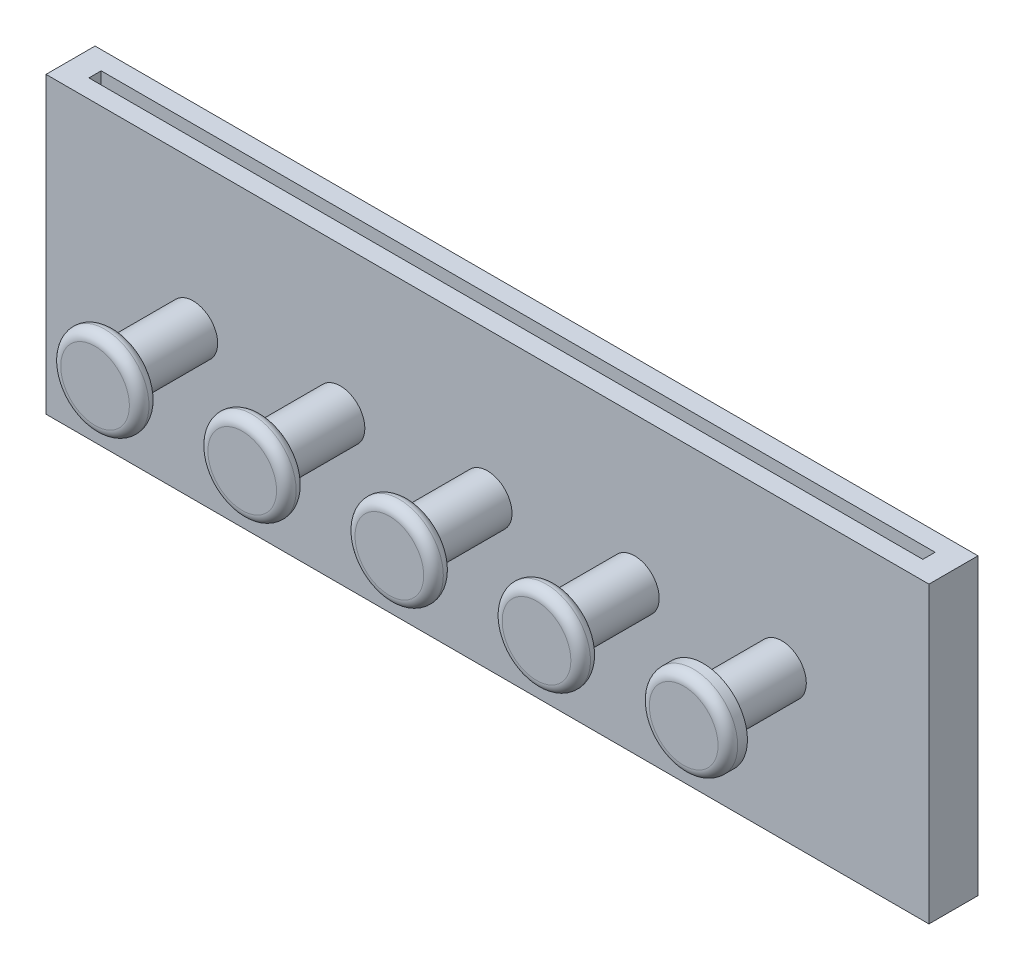
ISO-10303-21;
HEADER;
FILE_DESCRIPTION(('STEP AP214'),'2;1');
FILE_NAME('part.step','',(''),(''),'','','');
FILE_SCHEMA(('AUTOMOTIVE_DESIGN { 1 0 10303 214 1 1 1 1 }'));
ENDSEC;
DATA;
#1=APPLICATION_CONTEXT('core data for automotive mechanical design processes');
#2=APPLICATION_PROTOCOL_DEFINITION('international standard','automotive_design',2000,#1);
#3=PRODUCT_CONTEXT('',#1,'mechanical');
#4=PRODUCT('Part','Part','',(#3));
#5=PRODUCT_RELATED_PRODUCT_CATEGORY('part','',(#4));
#6=PRODUCT_DEFINITION_FORMATION('','',#4);
#7=PRODUCT_DEFINITION_CONTEXT('part definition',#1,'design');
#8=PRODUCT_DEFINITION('design','',#6,#7);
#9=PRODUCT_DEFINITION_SHAPE('','',#8);
#10=(LENGTH_UNIT() NAMED_UNIT(*) SI_UNIT(.MILLI.,.METRE.));
#11=(NAMED_UNIT(*) PLANE_ANGLE_UNIT() SI_UNIT($,.RADIAN.));
#12=(NAMED_UNIT(*) SI_UNIT($,.STERADIAN.) SOLID_ANGLE_UNIT());
#13=UNCERTAINTY_MEASURE_WITH_UNIT(LENGTH_MEASURE(1.E-05),#10,'distance_accuracy_value','');
#14=(GEOMETRIC_REPRESENTATION_CONTEXT(3) GLOBAL_UNCERTAINTY_ASSIGNED_CONTEXT((#13)) GLOBAL_UNIT_ASSIGNED_CONTEXT((#10,
#11,#12)) REPRESENTATION_CONTEXT('',''));
#15=CARTESIAN_POINT('',(0.,0.,0.));
#16=DIRECTION('',(0.,0.,1.));
#17=DIRECTION('',(1.,0.,0.));
#18=AXIS2_PLACEMENT_3D('',#15,#16,#17);
#19=CARTESIAN_POINT('',(96.6369985141159,36.4434315148656,38.1));
#20=DIRECTION('',(0.,0.,-1.));
#21=DIRECTION('',(-1.,0.,0.));
#22=AXIS2_PLACEMENT_3D('',#19,#20,#21);
#23=CYLINDRICAL_SURFACE('',#22,6.35);
#24=CARTESIAN_POINT('',(96.6369985141159,36.4434315148656,12.7));
#25=DIRECTION('',(0.,0.,1.));
#26=DIRECTION('',(1.,0.,0.));
#27=AXIS2_PLACEMENT_3D('',#24,#25,#26);
#28=CIRCLE('',#27,6.35);
#29=CARTESIAN_POINT('',(102.986998514116,36.4434315148656,12.7));
#30=VERTEX_POINT('',#29);
#31=EDGE_CURVE('E188',#30,#30,#28,.T.);
#32=ORIENTED_EDGE('',*,*,#31,.T.);
#33=EDGE_LOOP('',(#32));
#34=FACE_BOUND('',#33,.T.);
#35=CARTESIAN_POINT('',(96.6369985141159,36.4434315148656,33.02));
#36=DIRECTION('',(0.,0.,1.));
#37=DIRECTION('',(1.,0.,0.));
#38=AXIS2_PLACEMENT_3D('',#35,#36,#37);
#39=CIRCLE('',#38,6.35);
#40=CARTESIAN_POINT('',(102.986998514116,36.4434315148656,33.02));
#41=VERTEX_POINT('',#40);
#42=EDGE_CURVE('E243',#41,#41,#39,.T.);
#43=ORIENTED_EDGE('',*,*,#42,.F.);
#44=EDGE_LOOP('',(#43));
#45=FACE_BOUND('',#44,.T.);
#46=ADVANCED_FACE('F39',(#34,#45),#23,.T.);
#47=CARTESIAN_POINT('',(58.5369985141159,36.4434315148656,38.1));
#48=DIRECTION('',(0.,0.,-1.));
#49=DIRECTION('',(-1.,0.,0.));
#50=AXIS2_PLACEMENT_3D('',#47,#48,#49);
#51=CYLINDRICAL_SURFACE('',#50,6.35);
#52=CARTESIAN_POINT('',(58.5369985141159,36.4434315148656,12.7));
#53=DIRECTION('',(0.,0.,1.));
#54=DIRECTION('',(1.,0.,0.));
#55=AXIS2_PLACEMENT_3D('',#52,#53,#54);
#56=CIRCLE('',#55,6.35);
#57=CARTESIAN_POINT('',(64.8869985141159,36.4434315148656,12.7));
#58=VERTEX_POINT('',#57);
#59=EDGE_CURVE('E184',#58,#58,#56,.T.);
#60=ORIENTED_EDGE('',*,*,#59,.T.);
#61=EDGE_LOOP('',(#60));
#62=FACE_BOUND('',#61,.T.);
#63=CARTESIAN_POINT('',(58.5369985141159,36.4434315148656,33.02));
#64=DIRECTION('',(0.,0.,1.));
#65=DIRECTION('',(1.,0.,0.));
#66=AXIS2_PLACEMENT_3D('',#63,#64,#65);
#67=CIRCLE('',#66,6.35);
#68=CARTESIAN_POINT('',(64.8869985141159,36.4434315148656,33.02));
#69=VERTEX_POINT('',#68);
#70=EDGE_CURVE('E239',#69,#69,#67,.T.);
#71=ORIENTED_EDGE('',*,*,#70,.F.);
#72=EDGE_LOOP('',(#71));
#73=FACE_BOUND('',#72,.T.);
#74=ADVANCED_FACE('F312',(#62,#73),#51,.T.);
#75=CARTESIAN_POINT('',(20.4369985141159,36.4434315148656,38.1));
#76=DIRECTION('',(0.,0.,-1.));
#77=DIRECTION('',(-1.,0.,0.));
#78=AXIS2_PLACEMENT_3D('',#75,#76,#77);
#79=CYLINDRICAL_SURFACE('',#78,6.35);
#80=CARTESIAN_POINT('',(20.4369985141159,36.4434315148656,12.7));
#81=DIRECTION('',(0.,0.,1.));
#82=DIRECTION('',(1.,0.,0.));
#83=AXIS2_PLACEMENT_3D('',#80,#81,#82);
#84=CIRCLE('',#83,6.35);
#85=CARTESIAN_POINT('',(26.7869985141159,36.4434315148656,12.7));
#86=VERTEX_POINT('',#85);
#87=EDGE_CURVE('E180',#86,#86,#84,.T.);
#88=ORIENTED_EDGE('',*,*,#87,.T.);
#89=EDGE_LOOP('',(#88));
#90=FACE_BOUND('',#89,.T.);
#91=CARTESIAN_POINT('',(20.4369985141159,36.4434315148656,33.02));
#92=DIRECTION('',(0.,0.,1.));
#93=DIRECTION('',(1.,0.,0.));
#94=AXIS2_PLACEMENT_3D('',#91,#92,#93);
#95=CIRCLE('',#94,6.35);
#96=CARTESIAN_POINT('',(26.7869985141159,36.4434315148656,33.02));
#97=VERTEX_POINT('',#96);
#98=EDGE_CURVE('E235',#97,#97,#95,.T.);
#99=ORIENTED_EDGE('',*,*,#98,.F.);
#100=EDGE_LOOP('',(#99));
#101=FACE_BOUND('',#100,.T.);
#102=ADVANCED_FACE('F318',(#90,#101),#79,.T.);
#103=CARTESIAN_POINT('',(-17.6630014858841,36.4434315148656,38.1));
#104=DIRECTION('',(0.,0.,-1.));
#105=DIRECTION('',(-1.,0.,0.));
#106=AXIS2_PLACEMENT_3D('',#103,#104,#105);
#107=CYLINDRICAL_SURFACE('',#106,6.35);
#108=CARTESIAN_POINT('',(-17.6630014858841,36.4434315148656,12.7));
#109=DIRECTION('',(0.,0.,1.));
#110=DIRECTION('',(1.,0.,0.));
#111=AXIS2_PLACEMENT_3D('',#108,#109,#110);
#112=CIRCLE('',#111,6.35);
#113=CARTESIAN_POINT('',(-11.3130014858841,36.4434315148656,12.7));
#114=VERTEX_POINT('',#113);
#115=EDGE_CURVE('E176',#114,#114,#112,.T.);
#116=ORIENTED_EDGE('',*,*,#115,.T.);
#117=EDGE_LOOP('',(#116));
#118=FACE_BOUND('',#117,.T.);
#119=CARTESIAN_POINT('',(-17.6630014858841,36.4434315148656,33.02));
#120=DIRECTION('',(0.,0.,1.));
#121=DIRECTION('',(1.,0.,0.));
#122=AXIS2_PLACEMENT_3D('',#119,#120,#121);
#123=CIRCLE('',#122,6.35);
#124=CARTESIAN_POINT('',(-11.3130014858841,36.4434315148656,33.02));
#125=VERTEX_POINT('',#124);
#126=EDGE_CURVE('E231',#125,#125,#123,.T.);
#127=ORIENTED_EDGE('',*,*,#126,.F.);
#128=EDGE_LOOP('',(#127));
#129=FACE_BOUND('',#128,.T.);
#130=ADVANCED_FACE('F395',(#118,#129),#107,.T.);
#131=CARTESIAN_POINT('',(-55.7630014858841,36.4434315148656,38.1));
#132=DIRECTION('',(0.,0.,-1.));
#133=DIRECTION('',(-1.,0.,0.));
#134=AXIS2_PLACEMENT_3D('',#131,#132,#133);
#135=CYLINDRICAL_SURFACE('',#134,6.35);
#136=CARTESIAN_POINT('',(-55.7630014858841,36.4434315148656,12.7));
#137=DIRECTION('',(0.,0.,1.));
#138=DIRECTION('',(1.,0.,0.));
#139=AXIS2_PLACEMENT_3D('',#136,#137,#138);
#140=CIRCLE('',#139,6.35);
#141=CARTESIAN_POINT('',(-49.4130014858841,36.4434315148656,12.7));
#142=VERTEX_POINT('',#141);
#143=EDGE_CURVE('E171',#142,#142,#140,.T.);
#144=ORIENTED_EDGE('',*,*,#143,.T.);
#145=EDGE_LOOP('',(#144));
#146=FACE_BOUND('',#145,.T.);
#147=CARTESIAN_POINT('',(-55.7630014858841,36.4434315148656,33.02));
#148=DIRECTION('',(0.,0.,1.));
#149=DIRECTION('',(1.,0.,0.));
#150=AXIS2_PLACEMENT_3D('',#147,#148,#149);
#151=CIRCLE('',#150,6.35);
#152=CARTESIAN_POINT('',(-49.4130014858841,36.4434315148656,33.02));
#153=VERTEX_POINT('',#152);
#154=EDGE_CURVE('E227',#153,#153,#151,.T.);
#155=ORIENTED_EDGE('',*,*,#154,.F.);
#156=EDGE_LOOP('',(#155));
#157=FACE_BOUND('',#156,.T.);
#158=ADVANCED_FACE('F349',(#146,#157),#135,.T.);
#159=CARTESIAN_POINT('',(-93.8630014858841,74.5434315148656,12.7));
#160=DIRECTION('',(1.,0.,0.));
#161=DIRECTION('',(0.,1.,0.));
#162=AXIS2_PLACEMENT_3D('',#159,#160,#161);
#163=PLANE('',#162);
#164=DIRECTION('',(0.,-1.,0.));
#165=VECTOR('',#164,1.);
#166=CARTESIAN_POINT('',(-93.8630014858841,74.5434315148656,0.));
#167=LINE('',#166,#165);
#168=CARTESIAN_POINT('',(-93.8630014858841,74.5434315148656,0.));
#169=VERTEX_POINT('',#168);
#170=CARTESIAN_POINT('',(-93.863001485884,-1.65656848513442,0.));
#171=VERTEX_POINT('',#170);
#172=EDGE_CURVE('E192',#169,#171,#167,.T.);
#173=ORIENTED_EDGE('',*,*,#172,.T.);
#174=DIRECTION('',(0.,0.,-1.));
#175=VECTOR('',#174,1.);
#176=CARTESIAN_POINT('',(-93.863001485884,-1.65656848513442,12.7));
#177=LINE('',#176,#175);
#178=CARTESIAN_POINT('',(-93.863001485884,-1.65656848513442,12.7));
#179=VERTEX_POINT('',#178);
#180=EDGE_CURVE('E224',#179,#171,#177,.T.);
#181=ORIENTED_EDGE('',*,*,#180,.F.);
#182=DIRECTION('',(0.,-1.,0.));
#183=VECTOR('',#182,1.);
#184=CARTESIAN_POINT('',(-93.8630014858841,74.5434315148656,12.7));
#185=LINE('',#184,#183);
#186=CARTESIAN_POINT('',(-93.8630014858841,74.5434315148656,12.7));
#187=VERTEX_POINT('',#186);
#188=EDGE_CURVE('E193',#187,#179,#185,.T.);
#189=ORIENTED_EDGE('',*,*,#188,.F.);
#190=DIRECTION('',(0.,0.,-1.));
#191=VECTOR('',#190,1.);
#192=CARTESIAN_POINT('',(-93.8630014858841,74.5434315148656,12.7));
#193=LINE('',#192,#191);
#194=EDGE_CURVE('E203',#187,#169,#193,.T.);
#195=ORIENTED_EDGE('',*,*,#194,.T.);
#196=EDGE_LOOP('',(#173,#181,#189,#195));
#197=FACE_BOUND('',#196,.T.);
#198=ADVANCED_FACE('F346',(#197),#163,.F.);
#199=CARTESIAN_POINT('',(-93.863001485884,-1.65656848513442,12.7));
#200=DIRECTION('',(0.,1.,0.));
#201=DIRECTION('',(0.,0.,1.));
#202=AXIS2_PLACEMENT_3D('',#199,#200,#201);
#203=PLANE('',#202);
#204=DIRECTION('',(1.,0.,0.));
#205=VECTOR('',#204,1.);
#206=CARTESIAN_POINT('',(-93.863001485884,-1.65656848513442,0.));
#207=LINE('',#206,#205);
#208=CARTESIAN_POINT('',(134.736998514116,-1.65656848513442,0.));
#209=VERTEX_POINT('',#208);
#210=EDGE_CURVE('E207',#171,#209,#207,.T.);
#211=ORIENTED_EDGE('',*,*,#210,.T.);
#212=DIRECTION('',(0.,0.,-1.));
#213=VECTOR('',#212,1.);
#214=CARTESIAN_POINT('',(134.736998514116,-1.65656848513442,12.7));
#215=LINE('',#214,#213);
#216=CARTESIAN_POINT('',(134.736998514116,-1.65656848513442,12.7));
#217=VERTEX_POINT('',#216);
#218=EDGE_CURVE('E220',#217,#209,#215,.T.);
#219=ORIENTED_EDGE('',*,*,#218,.F.);
#220=DIRECTION('',(1.,0.,0.));
#221=VECTOR('',#220,1.);
#222=CARTESIAN_POINT('',(-93.863001485884,-1.65656848513442,12.7));
#223=LINE('',#222,#221);
#224=EDGE_CURVE('E95',#179,#217,#223,.T.);
#225=ORIENTED_EDGE('',*,*,#224,.F.);
#226=ORIENTED_EDGE('',*,*,#180,.T.);
#227=EDGE_LOOP('',(#211,#219,#225,#226));
#228=FACE_BOUND('',#227,.T.);
#229=ADVANCED_FACE('F342',(#228),#203,.F.);
#230=CARTESIAN_POINT('',(134.736998514116,74.5434315148656,12.7));
#231=DIRECTION('',(-1.,0.,0.));
#232=DIRECTION('',(0.,-1.,0.));
#233=AXIS2_PLACEMENT_3D('',#230,#231,#232);
#234=PLANE('',#233);
#235=DIRECTION('',(0.,1.,0.));
#236=VECTOR('',#235,1.);
#237=CARTESIAN_POINT('',(134.736998514116,74.5434315148656,0.));
#238=LINE('',#237,#236);
#239=CARTESIAN_POINT('',(134.736998514116,74.5434315148656,0.));
#240=VERTEX_POINT('',#239);
#241=EDGE_CURVE('E210',#209,#240,#238,.T.);
#242=ORIENTED_EDGE('',*,*,#241,.T.);
#243=DIRECTION('',(0.,0.,-1.));
#244=VECTOR('',#243,1.);
#245=CARTESIAN_POINT('',(134.736998514116,74.5434315148656,12.7));
#246=LINE('',#245,#244);
#247=CARTESIAN_POINT('',(134.736998514116,74.5434315148656,12.7));
#248=VERTEX_POINT('',#247);
#249=EDGE_CURVE('E217',#248,#240,#246,.T.);
#250=ORIENTED_EDGE('',*,*,#249,.F.);
#251=DIRECTION('',(0.,1.,0.));
#252=VECTOR('',#251,1.);
#253=CARTESIAN_POINT('',(134.736998514116,74.5434315148656,12.7));
#254=LINE('',#253,#252);
#255=EDGE_CURVE('E198',#217,#248,#254,.T.);
#256=ORIENTED_EDGE('',*,*,#255,.F.);
#257=ORIENTED_EDGE('',*,*,#218,.T.);
#258=EDGE_LOOP('',(#242,#250,#256,#257));
#259=FACE_BOUND('',#258,.T.);
#260=ADVANCED_FACE('F338',(#259),#234,.F.);
#261=CARTESIAN_POINT('',(-93.8630014858841,74.5434315148656,12.7));
#262=DIRECTION('',(0.,-1.,0.));
#263=DIRECTION('',(0.,0.,-1.));
#264=AXIS2_PLACEMENT_3D('',#261,#262,#263);
#265=PLANE('',#264);
#266=DIRECTION('',(1.,0.,0.));
#267=VECTOR('',#266,1.);
#268=CARTESIAN_POINT('',(-87.5130014858841,74.5434315148656,7.9375));
#269=LINE('',#268,#267);
#270=CARTESIAN_POINT('',(-87.5130014858841,74.5434315148656,7.9375));
#271=VERTEX_POINT('',#270);
#272=CARTESIAN_POINT('',(128.386998514116,74.5434315148656,7.9375));
#273=VERTEX_POINT('',#272);
#274=EDGE_CURVE('E153',#271,#273,#269,.T.);
#275=ORIENTED_EDGE('',*,*,#274,.F.);
#276=DIRECTION('',(0.,0.,1.));
#277=VECTOR('',#276,1.);
#278=CARTESIAN_POINT('',(-87.5130014858841,74.5434315148656,4.7625));
#279=LINE('',#278,#277);
#280=CARTESIAN_POINT('',(-87.5130014858841,74.5434315148656,4.7625));
#281=VERTEX_POINT('',#280);
#282=EDGE_CURVE('E57',#281,#271,#279,.T.);
#283=ORIENTED_EDGE('',*,*,#282,.F.);
#284=DIRECTION('',(-1.,0.,0.));
#285=VECTOR('',#284,1.);
#286=CARTESIAN_POINT('',(-87.5130014858841,74.5434315148656,4.7625));
#287=LINE('',#286,#285);
#288=CARTESIAN_POINT('',(128.386998514116,74.5434315148656,4.7625));
#289=VERTEX_POINT('',#288);
#290=EDGE_CURVE('E140',#289,#281,#287,.T.);
#291=ORIENTED_EDGE('',*,*,#290,.F.);
#292=DIRECTION('',(0.,0.,-1.));
#293=VECTOR('',#292,1.);
#294=CARTESIAN_POINT('',(128.386998514116,74.5434315148656,4.7625));
#295=LINE('',#294,#293);
#296=EDGE_CURVE('E144',#273,#289,#295,.T.);
#297=ORIENTED_EDGE('',*,*,#296,.F.);
#298=EDGE_LOOP('',(#275,#283,#291,#297));
#299=FACE_BOUND('',#298,.T.);
#300=DIRECTION('',(-1.,0.,0.));
#301=VECTOR('',#300,1.);
#302=CARTESIAN_POINT('',(-93.8630014858841,74.5434315148656,0.));
#303=LINE('',#302,#301);
#304=EDGE_CURVE('E87',#240,#169,#303,.T.);
#305=ORIENTED_EDGE('',*,*,#304,.T.);
#306=ORIENTED_EDGE('',*,*,#194,.F.);
#307=DIRECTION('',(-1.,0.,0.));
#308=VECTOR('',#307,1.);
#309=CARTESIAN_POINT('',(-93.8630014858841,74.5434315148656,12.7));
#310=LINE('',#309,#308);
#311=EDGE_CURVE('E66',#248,#187,#310,.T.);
#312=ORIENTED_EDGE('',*,*,#311,.F.);
#313=ORIENTED_EDGE('',*,*,#249,.T.);
#314=EDGE_LOOP('',(#305,#306,#312,#313));
#315=FACE_BOUND('',#314,.T.);
#316=ADVANCED_FACE('F330',(#299,#315),#265,.F.);
#317=CARTESIAN_POINT('',(0.,0.,12.7));
#318=DIRECTION('',(0.,0.,1.));
#319=DIRECTION('',(1.,0.,0.));
#320=AXIS2_PLACEMENT_3D('',#317,#318,#319);
#321=PLANE('',#320);
#322=ORIENTED_EDGE('',*,*,#143,.F.);
#323=EDGE_LOOP('',(#322));
#324=FACE_BOUND('',#323,.T.);
#325=ORIENTED_EDGE('',*,*,#115,.F.);
#326=EDGE_LOOP('',(#325));
#327=FACE_BOUND('',#326,.T.);
#328=ORIENTED_EDGE('',*,*,#87,.F.);
#329=EDGE_LOOP('',(#328));
#330=FACE_BOUND('',#329,.T.);
#331=ORIENTED_EDGE('',*,*,#59,.F.);
#332=EDGE_LOOP('',(#331));
#333=FACE_BOUND('',#332,.T.);
#334=ORIENTED_EDGE('',*,*,#31,.F.);
#335=EDGE_LOOP('',(#334));
#336=FACE_BOUND('',#335,.T.);
#337=ORIENTED_EDGE('',*,*,#188,.T.);
#338=ORIENTED_EDGE('',*,*,#224,.T.);
#339=ORIENTED_EDGE('',*,*,#255,.T.);
#340=ORIENTED_EDGE('',*,*,#311,.T.);
#341=EDGE_LOOP('',(#337,#338,#339,#340));
#342=FACE_BOUND('',#341,.T.);
#343=ADVANCED_FACE('F326',(#324,#327,#330,#333,#336,#342),#321,.T.);
#344=CARTESIAN_POINT('',(0.,0.,0.));
#345=DIRECTION('',(0.,0.,1.));
#346=DIRECTION('',(1.,0.,0.));
#347=AXIS2_PLACEMENT_3D('',#344,#345,#346);
#348=PLANE('',#347);
#349=ORIENTED_EDGE('',*,*,#172,.F.);
#350=ORIENTED_EDGE('',*,*,#304,.F.);
#351=ORIENTED_EDGE('',*,*,#241,.F.);
#352=ORIENTED_EDGE('',*,*,#210,.F.);
#353=EDGE_LOOP('',(#349,#350,#351,#352));
#354=FACE_BOUND('',#353,.T.);
#355=ADVANCED_FACE('F329',(#354),#348,.F.);
#356=CARTESIAN_POINT('',(-55.7630014858841,36.4434315148656,33.02));
#357=DIRECTION('',(0.,0.,1.));
#358=DIRECTION('',(1.,0.,0.));
#359=AXIS2_PLACEMENT_3D('',#356,#357,#358);
#360=PLANE('',#359);
#361=CARTESIAN_POINT('',(-55.7630014858841,36.4434315148656,33.02));
#362=DIRECTION('',(0.,0.,1.));
#363=DIRECTION('',(1.,0.,0.));
#364=AXIS2_PLACEMENT_3D('',#361,#362,#363);
#365=CIRCLE('',#364,8.89);
#366=CARTESIAN_POINT('',(-46.8730014858841,36.4434315148656,33.02));
#367=VERTEX_POINT('',#366);
#368=EDGE_CURVE('E49',#367,#367,#365,.F.);
#369=ORIENTED_EDGE('',*,*,#368,.T.);
#370=EDGE_LOOP('',(#369));
#371=FACE_BOUND('',#370,.T.);
#372=ORIENTED_EDGE('',*,*,#154,.T.);
#373=EDGE_LOOP('',(#372));
#374=FACE_BOUND('',#373,.T.);
#375=ADVANCED_FACE('F334',(#371,#374),#360,.F.);
#376=CARTESIAN_POINT('',(-55.7630014858841,36.4434315148656,38.1));
#377=DIRECTION('',(0.,0.,1.));
#378=DIRECTION('',(1.,0.,0.));
#379=AXIS2_PLACEMENT_3D('',#376,#377,#378);
#380=PLANE('',#379);
#381=CARTESIAN_POINT('',(-55.7630014858841,36.4434315148656,38.1));
#382=DIRECTION('',(0.,0.,1.));
#383=DIRECTION('',(1.,0.,0.));
#384=AXIS2_PLACEMENT_3D('',#381,#382,#383);
#385=CIRCLE('',#384,8.89);
#386=CARTESIAN_POINT('',(-46.8730014858841,36.4434315148656,38.1));
#387=VERTEX_POINT('',#386);
#388=EDGE_CURVE('E11',#387,#387,#385,.T.);
#389=ORIENTED_EDGE('',*,*,#388,.T.);
#390=EDGE_LOOP('',(#389));
#391=FACE_BOUND('',#390,.T.);
#392=ADVANCED_FACE('F390',(#391),#380,.T.);
#393=CARTESIAN_POINT('',(-17.6630014858841,36.4434315148656,33.02));
#394=DIRECTION('',(0.,0.,1.));
#395=DIRECTION('',(1.,0.,0.));
#396=AXIS2_PLACEMENT_3D('',#393,#394,#395);
#397=PLANE('',#396);
#398=CARTESIAN_POINT('',(-17.6630014858841,36.4434315148656,33.02));
#399=DIRECTION('',(0.,0.,1.));
#400=DIRECTION('',(1.,0.,0.));
#401=AXIS2_PLACEMENT_3D('',#398,#399,#400);
#402=CIRCLE('',#401,8.89);
#403=CARTESIAN_POINT('',(-8.77300148588405,36.4434315148656,33.02));
#404=VERTEX_POINT('',#403);
#405=EDGE_CURVE('E271',#404,#404,#402,.F.);
#406=ORIENTED_EDGE('',*,*,#405,.T.);
#407=EDGE_LOOP('',(#406));
#408=FACE_BOUND('',#407,.T.);
#409=ORIENTED_EDGE('',*,*,#126,.T.);
#410=EDGE_LOOP('',(#409));
#411=FACE_BOUND('',#410,.T.);
#412=ADVANCED_FACE('F381',(#408,#411),#397,.F.);
#413=CARTESIAN_POINT('',(-17.6630014858841,36.4434315148656,38.1));
#414=DIRECTION('',(0.,0.,1.));
#415=DIRECTION('',(1.,0.,0.));
#416=AXIS2_PLACEMENT_3D('',#413,#414,#415);
#417=PLANE('',#416);
#418=CARTESIAN_POINT('',(-17.6630014858841,36.4434315148656,38.1));
#419=DIRECTION('',(0.,0.,1.));
#420=DIRECTION('',(1.,0.,0.));
#421=AXIS2_PLACEMENT_3D('',#418,#419,#420);
#422=CIRCLE('',#421,8.89);
#423=CARTESIAN_POINT('',(-8.77300148588405,36.4434315148656,38.1));
#424=VERTEX_POINT('',#423);
#425=EDGE_CURVE('E275',#424,#424,#422,.T.);
#426=ORIENTED_EDGE('',*,*,#425,.T.);
#427=EDGE_LOOP('',(#426));
#428=FACE_BOUND('',#427,.T.);
#429=ADVANCED_FACE('F378',(#428),#417,.T.);
#430=CARTESIAN_POINT('',(20.4369985141159,36.4434315148656,33.02));
#431=DIRECTION('',(0.,0.,1.));
#432=DIRECTION('',(1.,0.,0.));
#433=AXIS2_PLACEMENT_3D('',#430,#431,#432);
#434=PLANE('',#433);
#435=CARTESIAN_POINT('',(20.4369985141159,36.4434315148656,33.02));
#436=DIRECTION('',(0.,0.,1.));
#437=DIRECTION('',(1.,0.,0.));
#438=AXIS2_PLACEMENT_3D('',#435,#436,#437);
#439=CIRCLE('',#438,8.89);
#440=CARTESIAN_POINT('',(29.3269985141159,36.4434315148656,33.02));
#441=VERTEX_POINT('',#440);
#442=EDGE_CURVE('E263',#441,#441,#439,.F.);
#443=ORIENTED_EDGE('',*,*,#442,.T.);
#444=EDGE_LOOP('',(#443));
#445=FACE_BOUND('',#444,.T.);
#446=ORIENTED_EDGE('',*,*,#98,.T.);
#447=EDGE_LOOP('',(#446));
#448=FACE_BOUND('',#447,.T.);
#449=ADVANCED_FACE('F380',(#445,#448),#434,.F.);
#450=CARTESIAN_POINT('',(20.4369985141159,36.4434315148656,38.1));
#451=DIRECTION('',(0.,0.,1.));
#452=DIRECTION('',(1.,0.,0.));
#453=AXIS2_PLACEMENT_3D('',#450,#451,#452);
#454=PLANE('',#453);
#455=CARTESIAN_POINT('',(20.4369985141159,36.4434315148656,38.1));
#456=DIRECTION('',(0.,0.,1.));
#457=DIRECTION('',(1.,0.,0.));
#458=AXIS2_PLACEMENT_3D('',#455,#456,#457);
#459=CIRCLE('',#458,8.89);
#460=CARTESIAN_POINT('',(29.3269985141159,36.4434315148656,38.1));
#461=VERTEX_POINT('',#460);
#462=EDGE_CURVE('E267',#461,#461,#459,.T.);
#463=ORIENTED_EDGE('',*,*,#462,.T.);
#464=EDGE_LOOP('',(#463));
#465=FACE_BOUND('',#464,.T.);
#466=ADVANCED_FACE('F387',(#465),#454,.T.);
#467=CARTESIAN_POINT('',(58.536998514116,36.4434315148656,33.02));
#468=DIRECTION('',(0.,0.,1.));
#469=DIRECTION('',(1.,0.,0.));
#470=AXIS2_PLACEMENT_3D('',#467,#468,#469);
#471=PLANE('',#470);
#472=CARTESIAN_POINT('',(58.536998514116,36.4434315148656,33.02));
#473=DIRECTION('',(0.,0.,1.));
#474=DIRECTION('',(1.,0.,0.));
#475=AXIS2_PLACEMENT_3D('',#472,#473,#474);
#476=CIRCLE('',#475,8.89000000000001);
#477=CARTESIAN_POINT('',(67.426998514116,36.4434315148656,33.02));
#478=VERTEX_POINT('',#477);
#479=EDGE_CURVE('E255',#478,#478,#476,.F.);
#480=ORIENTED_EDGE('',*,*,#479,.T.);
#481=EDGE_LOOP('',(#480));
#482=FACE_BOUND('',#481,.T.);
#483=ORIENTED_EDGE('',*,*,#70,.T.);
#484=EDGE_LOOP('',(#483));
#485=FACE_BOUND('',#484,.T.);
#486=ADVANCED_FACE('F401',(#482,#485),#471,.F.);
#487=CARTESIAN_POINT('',(58.5369985141159,36.4434315148656,38.1));
#488=DIRECTION('',(0.,0.,1.));
#489=DIRECTION('',(1.,0.,0.));
#490=AXIS2_PLACEMENT_3D('',#487,#488,#489);
#491=PLANE('',#490);
#492=CARTESIAN_POINT('',(58.536998514116,36.4434315148656,38.1));
#493=DIRECTION('',(0.,0.,1.));
#494=DIRECTION('',(1.,0.,0.));
#495=AXIS2_PLACEMENT_3D('',#492,#493,#494);
#496=CIRCLE('',#495,8.89000000000001);
#497=CARTESIAN_POINT('',(67.426998514116,36.4434315148656,38.1));
#498=VERTEX_POINT('',#497);
#499=EDGE_CURVE('E259',#498,#498,#496,.T.);
#500=ORIENTED_EDGE('',*,*,#499,.T.);
#501=EDGE_LOOP('',(#500));
#502=FACE_BOUND('',#501,.T.);
#503=ADVANCED_FACE('F403',(#502),#491,.T.);
#504=CARTESIAN_POINT('',(96.6369985141159,36.4434315148656,33.02));
#505=DIRECTION('',(0.,0.,1.));
#506=DIRECTION('',(1.,0.,0.));
#507=AXIS2_PLACEMENT_3D('',#504,#505,#506);
#508=CYLINDRICAL_SURFACE('',#507,11.43);
#509=CARTESIAN_POINT('',(96.6369985141159,36.4434315148656,35.56));
#510=DIRECTION('',(0.,0.,1.));
#511=DIRECTION('',(1.,0.,0.));
#512=AXIS2_PLACEMENT_3D('',#509,#510,#511);
#513=CIRCLE('',#512,11.43);
#514=CARTESIAN_POINT('',(108.066998514116,36.4434315148656,35.56));
#515=VERTEX_POINT('',#514);
#516=EDGE_CURVE('E251',#515,#515,#513,.F.);
#517=ORIENTED_EDGE('',*,*,#516,.T.);
#518=EDGE_LOOP('',(#517));
#519=FACE_BOUND('',#518,.T.);
#520=CARTESIAN_POINT('',(96.6369985141159,36.4434315148656,33.02));
#521=DIRECTION('',(0.,0.,1.));
#522=DIRECTION('',(1.,0.,0.));
#523=AXIS2_PLACEMENT_3D('',#520,#521,#522);
#524=CIRCLE('',#523,11.43);
#525=CARTESIAN_POINT('',(108.066998514116,36.4434315148656,33.02));
#526=VERTEX_POINT('',#525);
#527=EDGE_CURVE('E167',#526,#526,#524,.T.);
#528=ORIENTED_EDGE('',*,*,#527,.T.);
#529=EDGE_LOOP('',(#528));
#530=FACE_BOUND('',#529,.T.);
#531=ADVANCED_FACE('F405',(#519,#530),#508,.T.);
#532=CARTESIAN_POINT('',(96.6369985141159,36.4434315148656,33.02));
#533=DIRECTION('',(0.,0.,1.));
#534=DIRECTION('',(1.,0.,0.));
#535=AXIS2_PLACEMENT_3D('',#532,#533,#534);
#536=PLANE('',#535);
#537=ORIENTED_EDGE('',*,*,#42,.T.);
#538=EDGE_LOOP('',(#537));
#539=FACE_BOUND('',#538,.T.);
#540=ORIENTED_EDGE('',*,*,#527,.F.);
#541=EDGE_LOOP('',(#540));
#542=FACE_BOUND('',#541,.T.);
#543=ADVANCED_FACE('F411',(#539,#542),#536,.F.);
#544=CARTESIAN_POINT('',(96.6369985141159,36.4434315148656,38.1));
#545=DIRECTION('',(0.,0.,1.));
#546=DIRECTION('',(1.,0.,0.));
#547=AXIS2_PLACEMENT_3D('',#544,#545,#546);
#548=PLANE('',#547);
#549=CARTESIAN_POINT('',(96.6369985141159,36.4434315148656,38.1));
#550=DIRECTION('',(0.,0.,1.));
#551=DIRECTION('',(1.,0.,0.));
#552=AXIS2_PLACEMENT_3D('',#549,#550,#551);
#553=CIRCLE('',#552,8.89);
#554=CARTESIAN_POINT('',(105.526998514116,36.4434315148656,38.1));
#555=VERTEX_POINT('',#554);
#556=EDGE_CURVE('E247',#555,#555,#553,.T.);
#557=ORIENTED_EDGE('',*,*,#556,.T.);
#558=EDGE_LOOP('',(#557));
#559=FACE_BOUND('',#558,.T.);
#560=ADVANCED_FACE('F324',(#559),#548,.T.);
#561=CARTESIAN_POINT('',(96.6369985141159,36.4434315148656,35.56));
#562=DIRECTION('',(0.,0.,1.));
#563=DIRECTION('',(1.,0.,0.));
#564=AXIS2_PLACEMENT_3D('',#561,#562,#563);
#565=TOROIDAL_SURFACE('',#564,8.89,2.54);
#566=ORIENTED_EDGE('',*,*,#516,.F.);
#567=EDGE_LOOP('',(#566));
#568=FACE_BOUND('',#567,.T.);
#569=ORIENTED_EDGE('',*,*,#556,.F.);
#570=EDGE_LOOP('',(#569));
#571=FACE_BOUND('',#570,.T.);
#572=ADVANCED_FACE('F351',(#568,#571),#565,.T.);
#573=CARTESIAN_POINT('',(58.536998514116,36.4434315148656,35.56));
#574=DIRECTION('',(0.,0.,1.));
#575=DIRECTION('',(1.,0.,0.));
#576=AXIS2_PLACEMENT_3D('',#573,#574,#575);
#577=TOROIDAL_SURFACE('',#576,8.89000000000001,2.54);
#578=ORIENTED_EDGE('',*,*,#499,.F.);
#579=EDGE_LOOP('',(#578));
#580=FACE_BOUND('',#579,.T.);
#581=CARTESIAN_POINT('',(58.536998514116,36.4434315148656,35.56));
#582=DIRECTION('',(0.,0.,1.));
#583=DIRECTION('',(1.,0.,0.));
#584=AXIS2_PLACEMENT_3D('',#581,#582,#583);
#585=CIRCLE('',#584,11.43);
#586=CARTESIAN_POINT('',(69.966998514116,36.4434315148656,35.56));
#587=VERTEX_POINT('',#586);
#588=EDGE_CURVE('E172',#587,#587,#585,.F.);
#589=ORIENTED_EDGE('',*,*,#588,.F.);
#590=EDGE_LOOP('',(#589));
#591=FACE_BOUND('',#590,.T.);
#592=ADVANCED_FACE('F354',(#580,#591),#577,.T.);
#593=CARTESIAN_POINT('',(58.536998514116,36.4434315148656,35.56));
#594=DIRECTION('',(0.,0.,1.));
#595=DIRECTION('',(1.,0.,0.));
#596=AXIS2_PLACEMENT_3D('',#593,#594,#595);
#597=TOROIDAL_SURFACE('',#596,8.89000000000001,2.54);
#598=ORIENTED_EDGE('',*,*,#479,.F.);
#599=EDGE_LOOP('',(#598));
#600=FACE_BOUND('',#599,.T.);
#601=ORIENTED_EDGE('',*,*,#588,.T.);
#602=EDGE_LOOP('',(#601));
#603=FACE_BOUND('',#602,.T.);
#604=ADVANCED_FACE('F356',(#600,#603),#597,.T.);
#605=CARTESIAN_POINT('',(20.4369985141159,36.4434315148656,35.56));
#606=DIRECTION('',(0.,0.,1.));
#607=DIRECTION('',(1.,0.,0.));
#608=AXIS2_PLACEMENT_3D('',#605,#606,#607);
#609=TOROIDAL_SURFACE('',#608,8.89,2.54);
#610=ORIENTED_EDGE('',*,*,#462,.F.);
#611=EDGE_LOOP('',(#610));
#612=FACE_BOUND('',#611,.T.);
#613=CARTESIAN_POINT('',(20.4369985141159,36.4434315148656,35.56));
#614=DIRECTION('',(0.,0.,1.));
#615=DIRECTION('',(1.,0.,0.));
#616=AXIS2_PLACEMENT_3D('',#613,#614,#615);
#617=CIRCLE('',#616,11.43);
#618=CARTESIAN_POINT('',(31.866998514116,36.4434315148656,35.56));
#619=VERTEX_POINT('',#618);
#620=EDGE_CURVE('E285',#619,#619,#617,.F.);
#621=ORIENTED_EDGE('',*,*,#620,.F.);
#622=EDGE_LOOP('',(#621));
#623=FACE_BOUND('',#622,.T.);
#624=ADVANCED_FACE('F359',(#612,#623),#609,.T.);
#625=CARTESIAN_POINT('',(20.4369985141159,36.4434315148656,35.56));
#626=DIRECTION('',(0.,0.,1.));
#627=DIRECTION('',(1.,0.,0.));
#628=AXIS2_PLACEMENT_3D('',#625,#626,#627);
#629=TOROIDAL_SURFACE('',#628,8.89,2.54);
#630=ORIENTED_EDGE('',*,*,#442,.F.);
#631=EDGE_LOOP('',(#630));
#632=FACE_BOUND('',#631,.T.);
#633=ORIENTED_EDGE('',*,*,#620,.T.);
#634=EDGE_LOOP('',(#633));
#635=FACE_BOUND('',#634,.T.);
#636=ADVANCED_FACE('F364',(#632,#635),#629,.T.);
#637=CARTESIAN_POINT('',(-17.6630014858841,36.4434315148656,35.56));
#638=DIRECTION('',(0.,0.,1.));
#639=DIRECTION('',(1.,0.,0.));
#640=AXIS2_PLACEMENT_3D('',#637,#638,#639);
#641=TOROIDAL_SURFACE('',#640,8.89,2.54);
#642=ORIENTED_EDGE('',*,*,#425,.F.);
#643=EDGE_LOOP('',(#642));
#644=FACE_BOUND('',#643,.T.);
#645=CARTESIAN_POINT('',(-17.6630014858841,36.4434315148656,35.56));
#646=DIRECTION('',(0.,0.,1.));
#647=DIRECTION('',(1.,0.,0.));
#648=AXIS2_PLACEMENT_3D('',#645,#646,#647);
#649=CIRCLE('',#648,11.43);
#650=CARTESIAN_POINT('',(-6.23300148588405,36.4434315148656,35.56));
#651=VERTEX_POINT('',#650);
#652=EDGE_CURVE('E288',#651,#651,#649,.F.);
#653=ORIENTED_EDGE('',*,*,#652,.F.);
#654=EDGE_LOOP('',(#653));
#655=FACE_BOUND('',#654,.T.);
#656=ADVANCED_FACE('F307',(#644,#655),#641,.T.);
#657=CARTESIAN_POINT('',(-17.6630014858841,36.4434315148656,35.56));
#658=DIRECTION('',(0.,0.,1.));
#659=DIRECTION('',(1.,0.,0.));
#660=AXIS2_PLACEMENT_3D('',#657,#658,#659);
#661=TOROIDAL_SURFACE('',#660,8.89,2.54);
#662=ORIENTED_EDGE('',*,*,#405,.F.);
#663=EDGE_LOOP('',(#662));
#664=FACE_BOUND('',#663,.T.);
#665=ORIENTED_EDGE('',*,*,#652,.T.);
#666=EDGE_LOOP('',(#665));
#667=FACE_BOUND('',#666,.T.);
#668=ADVANCED_FACE('F300',(#664,#667),#661,.T.);
#669=CARTESIAN_POINT('',(-55.7630014858841,36.4434315148656,35.56));
#670=DIRECTION('',(0.,0.,1.));
#671=DIRECTION('',(1.,0.,0.));
#672=AXIS2_PLACEMENT_3D('',#669,#670,#671);
#673=TOROIDAL_SURFACE('',#672,8.89,2.54);
#674=ORIENTED_EDGE('',*,*,#388,.F.);
#675=EDGE_LOOP('',(#674));
#676=FACE_BOUND('',#675,.T.);
#677=CARTESIAN_POINT('',(-55.7630014858841,36.4434315148656,35.56));
#678=DIRECTION('',(0.,0.,1.));
#679=DIRECTION('',(1.,0.,0.));
#680=AXIS2_PLACEMENT_3D('',#677,#678,#679);
#681=CIRCLE('',#680,11.43);
#682=CARTESIAN_POINT('',(-44.3330014858841,36.4434315148656,35.56));
#683=VERTEX_POINT('',#682);
#684=EDGE_CURVE('E43',#683,#683,#681,.F.);
#685=ORIENTED_EDGE('',*,*,#684,.F.);
#686=EDGE_LOOP('',(#685));
#687=FACE_BOUND('',#686,.T.);
#688=ADVANCED_FACE('F41',(#676,#687),#673,.T.);
#689=CARTESIAN_POINT('',(-55.7630014858841,36.4434315148656,35.56));
#690=DIRECTION('',(0.,0.,1.));
#691=DIRECTION('',(1.,0.,0.));
#692=AXIS2_PLACEMENT_3D('',#689,#690,#691);
#693=TOROIDAL_SURFACE('',#692,8.89,2.54);
#694=ORIENTED_EDGE('',*,*,#368,.F.);
#695=EDGE_LOOP('',(#694));
#696=FACE_BOUND('',#695,.T.);
#697=ORIENTED_EDGE('',*,*,#684,.T.);
#698=EDGE_LOOP('',(#697));
#699=FACE_BOUND('',#698,.T.);
#700=ADVANCED_FACE('F297',(#696,#699),#693,.T.);
#701=CARTESIAN_POINT('',(-87.5130014858841,49.1434315148656,4.7625));
#702=DIRECTION('',(-1.,0.,0.));
#703=DIRECTION('',(0.,0.,1.));
#704=AXIS2_PLACEMENT_3D('',#701,#702,#703);
#705=PLANE('',#704);
#706=ORIENTED_EDGE('',*,*,#282,.T.);
#707=DIRECTION('',(0.,1.,0.));
#708=VECTOR('',#707,1.);
#709=CARTESIAN_POINT('',(-87.5130014858841,49.1434315148656,7.9375));
#710=LINE('',#709,#708);
#711=CARTESIAN_POINT('',(-87.5130014858841,49.1434315148656,7.9375));
#712=VERTEX_POINT('',#711);
#713=EDGE_CURVE('E115',#712,#271,#710,.T.);
#714=ORIENTED_EDGE('',*,*,#713,.F.);
#715=DIRECTION('',(0.,0.,1.));
#716=VECTOR('',#715,1.);
#717=CARTESIAN_POINT('',(-87.5130014858841,49.1434315148656,4.7625));
#718=LINE('',#717,#716);
#719=CARTESIAN_POINT('',(-87.5130014858841,49.1434315148656,4.7625));
#720=VERTEX_POINT('',#719);
#721=EDGE_CURVE('E119',#720,#712,#718,.T.);
#722=ORIENTED_EDGE('',*,*,#721,.F.);
#723=DIRECTION('',(0.,1.,0.));
#724=VECTOR('',#723,1.);
#725=CARTESIAN_POINT('',(-87.5130014858841,49.1434315148656,4.7625));
#726=LINE('',#725,#724);
#727=EDGE_CURVE('E159',#720,#281,#726,.T.);
#728=ORIENTED_EDGE('',*,*,#727,.T.);
#729=EDGE_LOOP('',(#706,#714,#722,#728));
#730=FACE_BOUND('',#729,.T.);
#731=ADVANCED_FACE('F117',(#730),#705,.F.);
#732=CARTESIAN_POINT('',(-87.5130014858841,49.1434315148656,4.7625));
#733=DIRECTION('',(0.,0.,-1.));
#734=DIRECTION('',(-1.,0.,0.));
#735=AXIS2_PLACEMENT_3D('',#732,#733,#734);
#736=PLANE('',#735);
#737=ORIENTED_EDGE('',*,*,#290,.T.);
#738=ORIENTED_EDGE('',*,*,#727,.F.);
#739=DIRECTION('',(-1.,0.,0.));
#740=VECTOR('',#739,1.);
#741=CARTESIAN_POINT('',(-87.5130014858841,49.1434315148656,4.7625));
#742=LINE('',#741,#740);
#743=CARTESIAN_POINT('',(128.386998514116,49.1434315148656,4.7625));
#744=VERTEX_POINT('',#743);
#745=EDGE_CURVE('E126',#744,#720,#742,.T.);
#746=ORIENTED_EDGE('',*,*,#745,.F.);
#747=DIRECTION('',(0.,1.,0.));
#748=VECTOR('',#747,1.);
#749=CARTESIAN_POINT('',(128.386998514116,49.1434315148656,4.7625));
#750=LINE('',#749,#748);
#751=EDGE_CURVE('E162',#744,#289,#750,.T.);
#752=ORIENTED_EDGE('',*,*,#751,.T.);
#753=EDGE_LOOP('',(#737,#738,#746,#752));
#754=FACE_BOUND('',#753,.T.);
#755=ADVANCED_FACE('F551',(#754),#736,.F.);
#756=CARTESIAN_POINT('',(128.386998514116,49.1434315148656,4.7625));
#757=DIRECTION('',(1.,0.,0.));
#758=DIRECTION('',(0.,0.,-1.));
#759=AXIS2_PLACEMENT_3D('',#756,#757,#758);
#760=PLANE('',#759);
#761=ORIENTED_EDGE('',*,*,#296,.T.);
#762=ORIENTED_EDGE('',*,*,#751,.F.);
#763=DIRECTION('',(0.,0.,-1.));
#764=VECTOR('',#763,1.);
#765=CARTESIAN_POINT('',(128.386998514116,49.1434315148656,4.7625));
#766=LINE('',#765,#764);
#767=CARTESIAN_POINT('',(128.386998514116,49.1434315148656,7.9375));
#768=VERTEX_POINT('',#767);
#769=EDGE_CURVE('E135',#768,#744,#766,.T.);
#770=ORIENTED_EDGE('',*,*,#769,.F.);
#771=DIRECTION('',(0.,1.,0.));
#772=VECTOR('',#771,1.);
#773=CARTESIAN_POINT('',(128.386998514116,49.1434315148656,7.9375));
#774=LINE('',#773,#772);
#775=EDGE_CURVE('E125',#768,#273,#774,.T.);
#776=ORIENTED_EDGE('',*,*,#775,.T.);
#777=EDGE_LOOP('',(#761,#762,#770,#776));
#778=FACE_BOUND('',#777,.T.);
#779=ADVANCED_FACE('F560',(#778),#760,.F.);
#780=CARTESIAN_POINT('',(-87.5130014858841,49.1434315148656,7.9375));
#781=DIRECTION('',(0.,0.,1.));
#782=DIRECTION('',(1.,0.,0.));
#783=AXIS2_PLACEMENT_3D('',#780,#781,#782);
#784=PLANE('',#783);
#785=ORIENTED_EDGE('',*,*,#274,.T.);
#786=ORIENTED_EDGE('',*,*,#775,.F.);
#787=DIRECTION('',(1.,0.,0.));
#788=VECTOR('',#787,1.);
#789=CARTESIAN_POINT('',(-87.5130014858841,49.1434315148656,7.9375));
#790=LINE('',#789,#788);
#791=EDGE_CURVE('E129',#712,#768,#790,.T.);
#792=ORIENTED_EDGE('',*,*,#791,.F.);
#793=ORIENTED_EDGE('',*,*,#713,.T.);
#794=EDGE_LOOP('',(#785,#786,#792,#793));
#795=FACE_BOUND('',#794,.T.);
#796=ADVANCED_FACE('F130',(#795),#784,.F.);
#797=CARTESIAN_POINT('',(0.,49.1434315148656,0.));
#798=DIRECTION('',(0.,1.,0.));
#799=DIRECTION('',(0.,0.,1.));
#800=AXIS2_PLACEMENT_3D('',#797,#798,#799);
#801=PLANE('',#800);
#802=ORIENTED_EDGE('',*,*,#721,.T.);
#803=ORIENTED_EDGE('',*,*,#791,.T.);
#804=ORIENTED_EDGE('',*,*,#769,.T.);
#805=ORIENTED_EDGE('',*,*,#745,.T.);
#806=EDGE_LOOP('',(#802,#803,#804,#805));
#807=FACE_BOUND('',#806,.T.);
#808=ADVANCED_FACE('F137',(#807),#801,.T.);
#809=CLOSED_SHELL('',(#46,#74,#102,#130,#158,#198,#229,#260,#316,#343,#355,#375,#392,#412,#429,
#449,#466,#486,#503,#531,#543,#560,#572,#592,#604,#624,#636,#656,#668,#688,#700,#731,#755,#779,
#796,#808));
#810=MANIFOLD_SOLID_BREP('B2',#809);
#811=ADVANCED_BREP_SHAPE_REPRESENTATION('',(#18,#810),#14);
#812=SHAPE_DEFINITION_REPRESENTATION(#9,#811);
ENDSEC;
END-ISO-10303-21;
